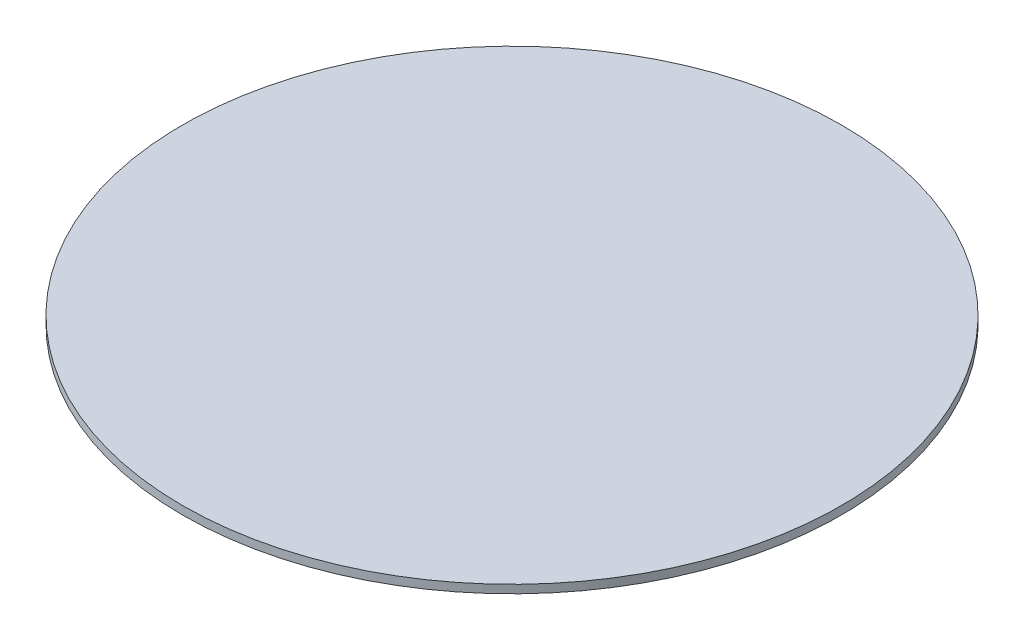
ISO-10303-21;
HEADER;
FILE_DESCRIPTION(('STEP AP214'),'2;1');
FILE_NAME('part.step','',(''),(''),'','','');
FILE_SCHEMA(('AUTOMOTIVE_DESIGN { 1 0 10303 214 1 1 1 1 }'));
ENDSEC;
DATA;
#1=APPLICATION_CONTEXT('core data for automotive mechanical design processes');
#2=APPLICATION_PROTOCOL_DEFINITION('international standard','automotive_design',2000,#1);
#3=PRODUCT_CONTEXT('',#1,'mechanical');
#4=PRODUCT('Part','Part','',(#3));
#5=PRODUCT_RELATED_PRODUCT_CATEGORY('part','',(#4));
#6=PRODUCT_DEFINITION_FORMATION('','',#4);
#7=PRODUCT_DEFINITION_CONTEXT('part definition',#1,'design');
#8=PRODUCT_DEFINITION('design','',#6,#7);
#9=PRODUCT_DEFINITION_SHAPE('','',#8);
#10=(LENGTH_UNIT() NAMED_UNIT(*) SI_UNIT(.MILLI.,.METRE.));
#11=(NAMED_UNIT(*) PLANE_ANGLE_UNIT() SI_UNIT($,.RADIAN.));
#12=(NAMED_UNIT(*) SI_UNIT($,.STERADIAN.) SOLID_ANGLE_UNIT());
#13=UNCERTAINTY_MEASURE_WITH_UNIT(LENGTH_MEASURE(1.E-05),#10,'distance_accuracy_value','');
#14=(GEOMETRIC_REPRESENTATION_CONTEXT(3) GLOBAL_UNCERTAINTY_ASSIGNED_CONTEXT((#13)) GLOBAL_UNIT_ASSIGNED_CONTEXT((#10,
#11,#12)) REPRESENTATION_CONTEXT('',''));
#15=CARTESIAN_POINT('',(0.,0.,0.));
#16=DIRECTION('',(0.,0.,1.));
#17=DIRECTION('',(1.,0.,0.));
#18=AXIS2_PLACEMENT_3D('',#15,#16,#17);
#19=CARTESIAN_POINT('',(0.,0.3,0.));
#20=DIRECTION('',(0.,-1.,0.));
#21=DIRECTION('',(0.,0.,-1.));
#22=AXIS2_PLACEMENT_3D('',#19,#20,#21);
#23=CYLINDRICAL_SURFACE('',#22,12.);
#24=CARTESIAN_POINT('',(0.,0.3,0.));
#25=DIRECTION('',(0.,1.,0.));
#26=DIRECTION('',(0.,0.,1.));
#27=AXIS2_PLACEMENT_3D('',#24,#25,#26);
#28=CIRCLE('',#27,12.);
#29=CARTESIAN_POINT('',(0.,0.3,12.));
#30=VERTEX_POINT('',#29);
#31=EDGE_CURVE('E10',#30,#30,#28,.T.);
#32=ORIENTED_EDGE('',*,*,#31,.F.);
#33=EDGE_LOOP('',(#32));
#34=FACE_BOUND('',#33,.T.);
#35=CARTESIAN_POINT('',(0.,0.,0.));
#36=DIRECTION('',(0.,1.,0.));
#37=DIRECTION('',(0.,0.,1.));
#38=AXIS2_PLACEMENT_3D('',#35,#36,#37);
#39=CIRCLE('',#38,12.);
#40=CARTESIAN_POINT('',(0.,0.,12.));
#41=VERTEX_POINT('',#40);
#42=EDGE_CURVE('E46',#41,#41,#39,.T.);
#43=ORIENTED_EDGE('',*,*,#42,.T.);
#44=EDGE_LOOP('',(#43));
#45=FACE_BOUND('',#44,.T.);
#46=ADVANCED_FACE('F43',(#34,#45),#23,.T.);
#47=CARTESIAN_POINT('',(0.,0.3,0.));
#48=DIRECTION('',(0.,1.,0.));
#49=DIRECTION('',(0.,0.,1.));
#50=AXIS2_PLACEMENT_3D('',#47,#48,#49);
#51=PLANE('',#50);
#52=ORIENTED_EDGE('',*,*,#31,.T.);
#53=EDGE_LOOP('',(#52));
#54=FACE_BOUND('',#53,.T.);
#55=ADVANCED_FACE('F60',(#54),#51,.T.);
#56=CARTESIAN_POINT('',(0.,0.,0.));
#57=DIRECTION('',(0.,1.,0.));
#58=DIRECTION('',(0.,0.,1.));
#59=AXIS2_PLACEMENT_3D('',#56,#57,#58);
#60=PLANE('',#59);
#61=ORIENTED_EDGE('',*,*,#42,.F.);
#62=EDGE_LOOP('',(#61));
#63=FACE_BOUND('',#62,.T.);
#64=ADVANCED_FACE('F58',(#63),#60,.F.);
#65=CLOSED_SHELL('',(#46,#55,#64));
#66=MANIFOLD_SOLID_BREP('B2',#65);
#67=ADVANCED_BREP_SHAPE_REPRESENTATION('',(#18,#66),#14);
#68=SHAPE_DEFINITION_REPRESENTATION(#9,#67);
ENDSEC;
END-ISO-10303-21;
